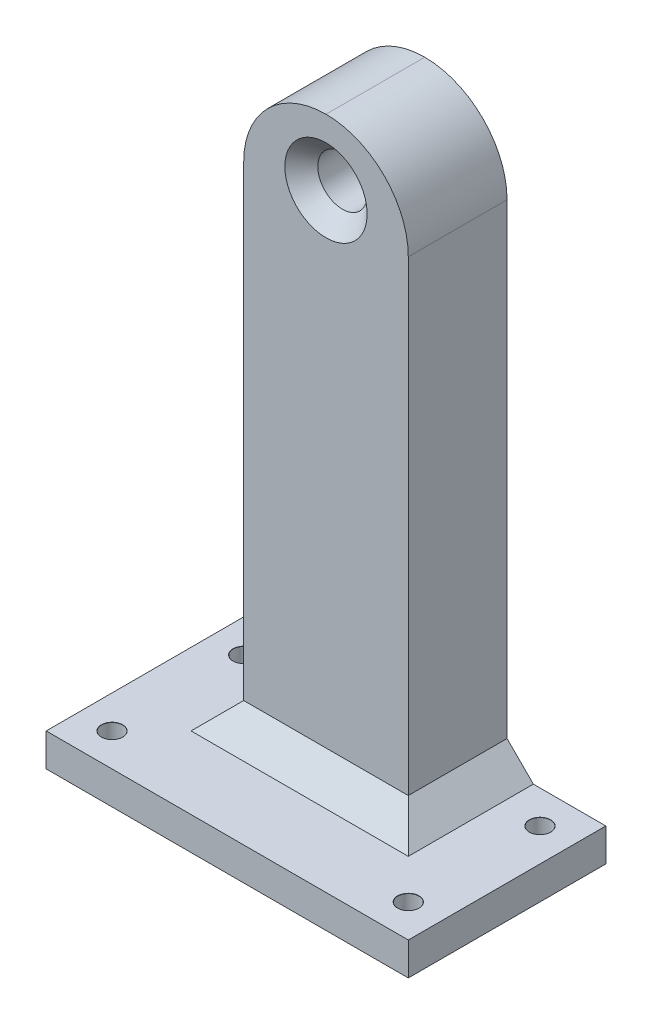
ISO-10303-21;
HEADER;
FILE_DESCRIPTION(('STEP AP214'),'2;1');
FILE_NAME('part.step','',(''),(''),'','','');
FILE_SCHEMA(('AUTOMOTIVE_DESIGN { 1 0 10303 214 1 1 1 1 }'));
ENDSEC;
DATA;
#1=APPLICATION_CONTEXT('core data for automotive mechanical design processes');
#2=APPLICATION_PROTOCOL_DEFINITION('international standard','automotive_design',2000,#1);
#3=PRODUCT_CONTEXT('',#1,'mechanical');
#4=PRODUCT('Part','Part','',(#3));
#5=PRODUCT_RELATED_PRODUCT_CATEGORY('part','',(#4));
#6=PRODUCT_DEFINITION_FORMATION('','',#4);
#7=PRODUCT_DEFINITION_CONTEXT('part definition',#1,'design');
#8=PRODUCT_DEFINITION('design','',#6,#7);
#9=PRODUCT_DEFINITION_SHAPE('','',#8);
#10=(LENGTH_UNIT() NAMED_UNIT(*) SI_UNIT(.MILLI.,.METRE.));
#11=(NAMED_UNIT(*) PLANE_ANGLE_UNIT() SI_UNIT($,.RADIAN.));
#12=(NAMED_UNIT(*) SI_UNIT($,.STERADIAN.) SOLID_ANGLE_UNIT());
#13=UNCERTAINTY_MEASURE_WITH_UNIT(LENGTH_MEASURE(1.E-05),#10,'distance_accuracy_value','');
#14=(GEOMETRIC_REPRESENTATION_CONTEXT(3) GLOBAL_UNCERTAINTY_ASSIGNED_CONTEXT((#13)) GLOBAL_UNIT_ASSIGNED_CONTEXT((#10,
#11,#12)) REPRESENTATION_CONTEXT('',''));
#15=CARTESIAN_POINT('',(0.,0.,0.));
#16=DIRECTION('',(0.,0.,1.));
#17=DIRECTION('',(1.,0.,0.));
#18=AXIS2_PLACEMENT_3D('',#15,#16,#17);
#19=CARTESIAN_POINT('',(0.,0.,15.));
#20=DIRECTION('',(0.,0.,-1.));
#21=DIRECTION('',(-1.,0.,0.));
#22=AXIS2_PLACEMENT_3D('',#19,#20,#21);
#23=PLANE('',#22);
#24=CARTESIAN_POINT('',(0.,82.37,15.));
#25=DIRECTION('',(0.,0.,-1.));
#26=DIRECTION('',(-1.,0.,0.));
#27=AXIS2_PLACEMENT_3D('',#24,#25,#26);
#28=CIRCLE('',#27,6.25000000000002);
#29=CARTESIAN_POINT('',(-6.25000000000002,82.37,15.));
#30=VERTEX_POINT('',#29);
#31=EDGE_CURVE('E11',#30,#30,#28,.T.);
#32=ORIENTED_EDGE('',*,*,#31,.T.);
#33=EDGE_LOOP('',(#32));
#34=FACE_BOUND('',#33,.T.);
#35=DIRECTION('',(0.,1.,0.));
#36=VECTOR('',#35,1.);
#37=CARTESIAN_POINT('',(12.5,92.37,15.));
#38=LINE('',#37,#36);
#39=CARTESIAN_POINT('',(12.5,9.00000000000004,15.));
#40=VERTEX_POINT('',#39);
#41=CARTESIAN_POINT('',(12.5,79.87,15.));
#42=VERTEX_POINT('',#41);
#43=EDGE_CURVE('E173',#40,#42,#38,.T.);
#44=ORIENTED_EDGE('',*,*,#43,.T.);
#45=CARTESIAN_POINT('',(0.,79.87,15.));
#46=DIRECTION('',(0.,0.,-1.));
#47=DIRECTION('',(-1.,0.,0.));
#48=AXIS2_PLACEMENT_3D('',#45,#46,#47);
#49=CIRCLE('',#48,12.5);
#50=CARTESIAN_POINT('',(0.,92.37,15.));
#51=VERTEX_POINT('',#50);
#52=EDGE_CURVE('E57',#42,#51,#49,.F.);
#53=ORIENTED_EDGE('',*,*,#52,.T.);
#54=CARTESIAN_POINT('',(0.,79.87,15.));
#55=DIRECTION('',(0.,0.,-1.));
#56=DIRECTION('',(-1.,0.,0.));
#57=AXIS2_PLACEMENT_3D('',#54,#55,#56);
#58=CIRCLE('',#57,12.5);
#59=CARTESIAN_POINT('',(-12.5,79.87,15.));
#60=VERTEX_POINT('',#59);
#61=EDGE_CURVE('E61',#51,#60,#58,.F.);
#62=ORIENTED_EDGE('',*,*,#61,.T.);
#63=DIRECTION('',(0.,-1.,0.));
#64=VECTOR('',#63,1.);
#65=CARTESIAN_POINT('',(-12.5,0.,15.));
#66=LINE('',#65,#64);
#67=CARTESIAN_POINT('',(-12.5,9.00000000000004,15.));
#68=VERTEX_POINT('',#67);
#69=EDGE_CURVE('E175',#60,#68,#66,.T.);
#70=ORIENTED_EDGE('',*,*,#69,.T.);
#71=DIRECTION('',(1.,0.,0.));
#72=VECTOR('',#71,1.);
#73=CARTESIAN_POINT('',(0.,9.00000000000003,15.));
#74=LINE('',#73,#72);
#75=EDGE_CURVE('E194',#68,#40,#74,.T.);
#76=ORIENTED_EDGE('',*,*,#75,.T.);
#77=EDGE_LOOP('',(#44,#53,#62,#70,#76));
#78=FACE_BOUND('',#77,.T.);
#79=ADVANCED_FACE('F41',(#34,#78),#23,.F.);
#80=CARTESIAN_POINT('',(0.,0.,0.));
#81=DIRECTION('',(0.,0.,-1.));
#82=DIRECTION('',(-1.,0.,0.));
#83=AXIS2_PLACEMENT_3D('',#80,#81,#82);
#84=PLANE('',#83);
#85=CARTESIAN_POINT('',(0.,79.87,0.));
#86=DIRECTION('',(0.,0.,-1.));
#87=DIRECTION('',(-1.,0.,0.));
#88=AXIS2_PLACEMENT_3D('',#85,#86,#87);
#89=CIRCLE('',#88,12.5);
#90=CARTESIAN_POINT('',(-12.5,79.87,0.));
#91=VERTEX_POINT('',#90);
#92=CARTESIAN_POINT('',(0.,92.37,0.));
#93=VERTEX_POINT('',#92);
#94=EDGE_CURVE('E201',#91,#93,#89,.T.);
#95=ORIENTED_EDGE('',*,*,#94,.T.);
#96=CARTESIAN_POINT('',(0.,79.87,0.));
#97=DIRECTION('',(0.,0.,-1.));
#98=DIRECTION('',(-1.,0.,0.));
#99=AXIS2_PLACEMENT_3D('',#96,#97,#98);
#100=CIRCLE('',#99,12.5);
#101=CARTESIAN_POINT('',(12.5,79.87,0.));
#102=VERTEX_POINT('',#101);
#103=EDGE_CURVE('E211',#93,#102,#100,.T.);
#104=ORIENTED_EDGE('',*,*,#103,.T.);
#105=DIRECTION('',(0.,1.,0.));
#106=VECTOR('',#105,1.);
#107=CARTESIAN_POINT('',(12.5,92.37,0.));
#108=LINE('',#107,#106);
#109=CARTESIAN_POINT('',(12.5,9.00000000000002,0.));
#110=VERTEX_POINT('',#109);
#111=EDGE_CURVE('E172',#110,#102,#108,.T.);
#112=ORIENTED_EDGE('',*,*,#111,.F.);
#113=DIRECTION('',(0.707106781186544,-0.707106781186551,0.));
#114=VECTOR('',#113,1.);
#115=CARTESIAN_POINT('',(12.5,9.00000000000002,0.));
#116=LINE('',#115,#114);
#117=CARTESIAN_POINT('',(16.5,5.,0.));
#118=VERTEX_POINT('',#117);
#119=EDGE_CURVE('E196',#110,#118,#116,.T.);
#120=ORIENTED_EDGE('',*,*,#119,.T.);
#121=DIRECTION('',(1.,0.,0.));
#122=VECTOR('',#121,1.);
#123=CARTESIAN_POINT('',(27.5,4.99999999999999,0.));
#124=LINE('',#123,#122);
#125=CARTESIAN_POINT('',(27.5,4.99999999999999,0.));
#126=VERTEX_POINT('',#125);
#127=EDGE_CURVE('E152',#118,#126,#124,.T.);
#128=ORIENTED_EDGE('',*,*,#127,.T.);
#129=DIRECTION('',(0.,-1.,0.));
#130=VECTOR('',#129,1.);
#131=CARTESIAN_POINT('',(27.5,0.,0.));
#132=LINE('',#131,#130);
#133=CARTESIAN_POINT('',(27.5,0.,0.));
#134=VERTEX_POINT('',#133);
#135=EDGE_CURVE('E160',#126,#134,#132,.T.);
#136=ORIENTED_EDGE('',*,*,#135,.T.);
#137=DIRECTION('',(1.,0.,0.));
#138=VECTOR('',#137,1.);
#139=CARTESIAN_POINT('',(0.,0.,0.));
#140=LINE('',#139,#138);
#141=CARTESIAN_POINT('',(-27.5,0.,0.));
#142=VERTEX_POINT('',#141);
#143=EDGE_CURVE('E128',#142,#134,#140,.T.);
#144=ORIENTED_EDGE('',*,*,#143,.F.);
#145=DIRECTION('',(0.,1.,0.));
#146=VECTOR('',#145,1.);
#147=CARTESIAN_POINT('',(-27.5,0.,0.));
#148=LINE('',#147,#146);
#149=CARTESIAN_POINT('',(-27.5,5.00000000000001,0.));
#150=VERTEX_POINT('',#149);
#151=EDGE_CURVE('E162',#142,#150,#148,.T.);
#152=ORIENTED_EDGE('',*,*,#151,.T.);
#153=CARTESIAN_POINT('',(-16.5,5.00000000000001,0.));
#154=VERTEX_POINT('',#153);
#155=EDGE_CURVE('E149',#150,#154,#124,.T.);
#156=ORIENTED_EDGE('',*,*,#155,.T.);
#157=DIRECTION('',(0.707106781186544,0.707106781186551,0.));
#158=VECTOR('',#157,1.);
#159=CARTESIAN_POINT('',(-12.5,9.00000000000004,0.));
#160=LINE('',#159,#158);
#161=CARTESIAN_POINT('',(-12.5,9.00000000000004,0.));
#162=VERTEX_POINT('',#161);
#163=EDGE_CURVE('E198',#154,#162,#160,.T.);
#164=ORIENTED_EDGE('',*,*,#163,.T.);
#165=DIRECTION('',(0.,-1.,0.));
#166=VECTOR('',#165,1.);
#167=CARTESIAN_POINT('',(-12.5,0.,0.));
#168=LINE('',#167,#166);
#169=EDGE_CURVE('E180',#91,#162,#168,.T.);
#170=ORIENTED_EDGE('',*,*,#169,.F.);
#171=EDGE_LOOP('',(#95,#104,#112,#120,#128,#136,#144,#152,#156,#164,#170));
#172=FACE_BOUND('',#171,.T.);
#173=CARTESIAN_POINT('',(0.,82.37,0.));
#174=DIRECTION('',(0.,0.,1.));
#175=DIRECTION('',(1.,0.,0.));
#176=AXIS2_PLACEMENT_3D('',#173,#174,#175);
#177=CIRCLE('',#176,3.75);
#178=CARTESIAN_POINT('',(3.75,82.37,0.));
#179=VERTEX_POINT('',#178);
#180=EDGE_CURVE('E166',#179,#179,#177,.T.);
#181=ORIENTED_EDGE('',*,*,#180,.T.);
#182=EDGE_LOOP('',(#181));
#183=FACE_BOUND('',#182,.T.);
#184=ADVANCED_FACE('F239',(#172,#183),#84,.T.);
#185=CARTESIAN_POINT('',(12.5,92.37,15.));
#186=DIRECTION('',(-1.,0.,0.));
#187=DIRECTION('',(0.,0.,1.));
#188=AXIS2_PLACEMENT_3D('',#185,#186,#187);
#189=PLANE('',#188);
#190=ORIENTED_EDGE('',*,*,#111,.T.);
#191=DIRECTION('',(0.,0.,-1.));
#192=VECTOR('',#191,1.);
#193=CARTESIAN_POINT('',(12.5,79.87,15.));
#194=LINE('',#193,#192);
#195=EDGE_CURVE('E213',#102,#42,#194,.F.);
#196=ORIENTED_EDGE('',*,*,#195,.T.);
#197=ORIENTED_EDGE('',*,*,#43,.F.);
#198=DIRECTION('',(0.,0.,-1.));
#199=VECTOR('',#198,1.);
#200=CARTESIAN_POINT('',(12.5,9.00000000000002,15.));
#201=LINE('',#200,#199);
#202=EDGE_CURVE('E177',#40,#110,#201,.T.);
#203=ORIENTED_EDGE('',*,*,#202,.T.);
#204=EDGE_LOOP('',(#190,#196,#197,#203));
#205=FACE_BOUND('',#204,.T.);
#206=ADVANCED_FACE('F245',(#205),#189,.F.);
#207=CARTESIAN_POINT('',(-12.5,0.,15.));
#208=DIRECTION('',(1.,0.,0.));
#209=DIRECTION('',(0.,0.,-1.));
#210=AXIS2_PLACEMENT_3D('',#207,#208,#209);
#211=PLANE('',#210);
#212=ORIENTED_EDGE('',*,*,#69,.F.);
#213=DIRECTION('',(0.,0.,-1.));
#214=VECTOR('',#213,1.);
#215=CARTESIAN_POINT('',(-12.5,79.87,15.));
#216=LINE('',#215,#214);
#217=EDGE_CURVE('E218',#60,#91,#216,.T.);
#218=ORIENTED_EDGE('',*,*,#217,.T.);
#219=ORIENTED_EDGE('',*,*,#169,.T.);
#220=DIRECTION('',(0.,0.,1.));
#221=VECTOR('',#220,1.);
#222=CARTESIAN_POINT('',(-12.5,9.00000000000004,15.));
#223=LINE('',#222,#221);
#224=EDGE_CURVE('E191',#162,#68,#223,.T.);
#225=ORIENTED_EDGE('',*,*,#224,.T.);
#226=EDGE_LOOP('',(#212,#218,#219,#225));
#227=FACE_BOUND('',#226,.T.);
#228=ADVANCED_FACE('F253',(#227),#211,.F.);
#229=CARTESIAN_POINT('',(0.,0.,15.));
#230=DIRECTION('',(0.,1.,0.));
#231=DIRECTION('',(-1.,0.,0.));
#232=AXIS2_PLACEMENT_3D('',#229,#230,#231);
#233=PLANE('',#232);
#234=CARTESIAN_POINT('',(-22.5,0.,5.));
#235=DIRECTION('',(0.,1.,0.));
#236=DIRECTION('',(0.,0.,1.));
#237=AXIS2_PLACEMENT_3D('',#234,#235,#236);
#238=CIRCLE('',#237,1.6);
#239=CARTESIAN_POINT('',(-22.5,0.,6.6));
#240=VERTEX_POINT('',#239);
#241=EDGE_CURVE('E361',#240,#240,#238,.T.);
#242=ORIENTED_EDGE('',*,*,#241,.T.);
#243=EDGE_LOOP('',(#242));
#244=FACE_BOUND('',#243,.T.);
#245=CARTESIAN_POINT('',(-22.5,0.,25.));
#246=DIRECTION('',(0.,1.,0.));
#247=DIRECTION('',(0.,0.,1.));
#248=AXIS2_PLACEMENT_3D('',#245,#246,#247);
#249=CIRCLE('',#248,1.6);
#250=CARTESIAN_POINT('',(-22.5,0.,26.6));
#251=VERTEX_POINT('',#250);
#252=EDGE_CURVE('E372',#251,#251,#249,.T.);
#253=ORIENTED_EDGE('',*,*,#252,.T.);
#254=EDGE_LOOP('',(#253));
#255=FACE_BOUND('',#254,.T.);
#256=CARTESIAN_POINT('',(22.5,0.,25.));
#257=DIRECTION('',(0.,1.,0.));
#258=DIRECTION('',(0.,0.,1.));
#259=AXIS2_PLACEMENT_3D('',#256,#257,#258);
#260=CIRCLE('',#259,1.6);
#261=CARTESIAN_POINT('',(22.5,0.,26.6));
#262=VERTEX_POINT('',#261);
#263=EDGE_CURVE('E381',#262,#262,#260,.T.);
#264=ORIENTED_EDGE('',*,*,#263,.T.);
#265=EDGE_LOOP('',(#264));
#266=FACE_BOUND('',#265,.T.);
#267=CARTESIAN_POINT('',(22.5,0.,5.));
#268=DIRECTION('',(0.,1.,0.));
#269=DIRECTION('',(0.,0.,1.));
#270=AXIS2_PLACEMENT_3D('',#267,#268,#269);
#271=CIRCLE('',#270,1.6);
#272=CARTESIAN_POINT('',(22.5,0.,6.6));
#273=VERTEX_POINT('',#272);
#274=EDGE_CURVE('E155',#273,#273,#271,.T.);
#275=ORIENTED_EDGE('',*,*,#274,.T.);
#276=EDGE_LOOP('',(#275));
#277=FACE_BOUND('',#276,.T.);
#278=ORIENTED_EDGE('',*,*,#143,.T.);
#279=DIRECTION('',(0.,0.,-1.));
#280=VECTOR('',#279,1.);
#281=CARTESIAN_POINT('',(27.5,0.,30.));
#282=LINE('',#281,#280);
#283=CARTESIAN_POINT('',(27.5,0.,30.));
#284=VERTEX_POINT('',#283);
#285=EDGE_CURVE('E123',#284,#134,#282,.T.);
#286=ORIENTED_EDGE('',*,*,#285,.F.);
#287=DIRECTION('',(-1.,0.,0.));
#288=VECTOR('',#287,1.);
#289=CARTESIAN_POINT('',(-27.5,0.,30.));
#290=LINE('',#289,#288);
#291=CARTESIAN_POINT('',(-27.5,0.,30.));
#292=VERTEX_POINT('',#291);
#293=EDGE_CURVE('E127',#284,#292,#290,.T.);
#294=ORIENTED_EDGE('',*,*,#293,.T.);
#295=DIRECTION('',(0.,0.,-1.));
#296=VECTOR('',#295,1.);
#297=CARTESIAN_POINT('',(-27.5,0.,30.));
#298=LINE('',#297,#296);
#299=EDGE_CURVE('E133',#292,#142,#298,.T.);
#300=ORIENTED_EDGE('',*,*,#299,.T.);
#301=EDGE_LOOP('',(#278,#286,#294,#300));
#302=FACE_BOUND('',#301,.T.);
#303=ADVANCED_FACE('F125',(#244,#255,#266,#277,#302),#233,.F.);
#304=CARTESIAN_POINT('',(0.,82.37,15.));
#305=DIRECTION('',(0.,0.,-1.));
#306=DIRECTION('',(-1.,0.,0.));
#307=AXIS2_PLACEMENT_3D('',#304,#305,#306);
#308=CYLINDRICAL_SURFACE('',#307,3.75);
#309=CARTESIAN_POINT('',(0.,82.37,12.5));
#310=DIRECTION('',(0.,0.,-1.));
#311=DIRECTION('',(-1.,0.,0.));
#312=AXIS2_PLACEMENT_3D('',#309,#310,#311);
#313=CIRCLE('',#312,3.75);
#314=CARTESIAN_POINT('',(-3.75,82.37,12.5));
#315=VERTEX_POINT('',#314);
#316=EDGE_CURVE('E50',#315,#315,#313,.F.);
#317=ORIENTED_EDGE('',*,*,#316,.T.);
#318=EDGE_LOOP('',(#317));
#319=FACE_BOUND('',#318,.T.);
#320=ORIENTED_EDGE('',*,*,#180,.F.);
#321=EDGE_LOOP('',(#320));
#322=FACE_BOUND('',#321,.T.);
#323=ADVANCED_FACE('F224',(#319,#322),#308,.F.);
#324=CARTESIAN_POINT('',(27.5,4.99999999999999,30.));
#325=DIRECTION('',(0.,1.,0.));
#326=DIRECTION('',(-1.,0.,0.));
#327=AXIS2_PLACEMENT_3D('',#324,#325,#326);
#328=PLANE('',#327);
#329=ORIENTED_EDGE('',*,*,#127,.F.);
#330=DIRECTION('',(0.,0.,1.));
#331=VECTOR('',#330,1.);
#332=CARTESIAN_POINT('',(16.5,5.,30.));
#333=LINE('',#332,#331);
#334=CARTESIAN_POINT('',(16.5,5.,19.));
#335=VERTEX_POINT('',#334);
#336=EDGE_CURVE('E189',#118,#335,#333,.T.);
#337=ORIENTED_EDGE('',*,*,#336,.T.);
#338=DIRECTION('',(-1.,0.,0.));
#339=VECTOR('',#338,1.);
#340=CARTESIAN_POINT('',(27.5,4.99999999999999,19.));
#341=LINE('',#340,#339);
#342=CARTESIAN_POINT('',(-16.5,5.00000000000001,19.));
#343=VERTEX_POINT('',#342);
#344=EDGE_CURVE('E185',#335,#343,#341,.T.);
#345=ORIENTED_EDGE('',*,*,#344,.T.);
#346=DIRECTION('',(0.,0.,-1.));
#347=VECTOR('',#346,1.);
#348=CARTESIAN_POINT('',(-16.5,5.00000000000001,30.));
#349=LINE('',#348,#347);
#350=EDGE_CURVE('E187',#343,#154,#349,.T.);
#351=ORIENTED_EDGE('',*,*,#350,.T.);
#352=ORIENTED_EDGE('',*,*,#155,.F.);
#353=DIRECTION('',(0.,0.,-1.));
#354=VECTOR('',#353,1.);
#355=CARTESIAN_POINT('',(-27.5,5.00000000000001,30.));
#356=LINE('',#355,#354);
#357=CARTESIAN_POINT('',(-27.5,5.00000000000001,30.));
#358=VERTEX_POINT('',#357);
#359=EDGE_CURVE('E167',#358,#150,#356,.T.);
#360=ORIENTED_EDGE('',*,*,#359,.F.);
#361=DIRECTION('',(1.,0.,0.));
#362=VECTOR('',#361,1.);
#363=CARTESIAN_POINT('',(27.5,4.99999999999999,30.));
#364=LINE('',#363,#362);
#365=CARTESIAN_POINT('',(27.5,4.99999999999999,30.));
#366=VERTEX_POINT('',#365);
#367=EDGE_CURVE('E134',#358,#366,#364,.T.);
#368=ORIENTED_EDGE('',*,*,#367,.T.);
#369=DIRECTION('',(0.,0.,-1.));
#370=VECTOR('',#369,1.);
#371=CARTESIAN_POINT('',(27.5,4.99999999999999,30.));
#372=LINE('',#371,#370);
#373=EDGE_CURVE('E148',#366,#126,#372,.T.);
#374=ORIENTED_EDGE('',*,*,#373,.T.);
#375=EDGE_LOOP('',(#329,#337,#345,#351,#352,#360,#368,#374));
#376=FACE_BOUND('',#375,.T.);
#377=CARTESIAN_POINT('',(-22.5,5.00000000000001,5.));
#378=DIRECTION('',(0.,1.,0.));
#379=DIRECTION('',(0.,0.,1.));
#380=AXIS2_PLACEMENT_3D('',#377,#378,#379);
#381=CIRCLE('',#380,1.625);
#382=CARTESIAN_POINT('',(-22.5,5.00000000000001,6.625));
#383=VERTEX_POINT('',#382);
#384=EDGE_CURVE('E209',#383,#383,#381,.T.);
#385=ORIENTED_EDGE('',*,*,#384,.F.);
#386=EDGE_LOOP('',(#385));
#387=FACE_BOUND('',#386,.T.);
#388=CARTESIAN_POINT('',(-22.5,5.00000000000001,25.));
#389=DIRECTION('',(0.,1.,0.));
#390=DIRECTION('',(0.,0.,1.));
#391=AXIS2_PLACEMENT_3D('',#388,#389,#390);
#392=CIRCLE('',#391,1.625);
#393=CARTESIAN_POINT('',(-22.5,5.00000000000001,26.625));
#394=VERTEX_POINT('',#393);
#395=EDGE_CURVE('E366',#394,#394,#392,.T.);
#396=ORIENTED_EDGE('',*,*,#395,.F.);
#397=EDGE_LOOP('',(#396));
#398=FACE_BOUND('',#397,.T.);
#399=CARTESIAN_POINT('',(22.5,5.,25.));
#400=DIRECTION('',(0.,1.,0.));
#401=DIRECTION('',(0.,0.,1.));
#402=AXIS2_PLACEMENT_3D('',#399,#400,#401);
#403=CIRCLE('',#402,1.625);
#404=CARTESIAN_POINT('',(22.5,5.,26.625));
#405=VERTEX_POINT('',#404);
#406=EDGE_CURVE('E375',#405,#405,#403,.T.);
#407=ORIENTED_EDGE('',*,*,#406,.F.);
#408=EDGE_LOOP('',(#407));
#409=FACE_BOUND('',#408,.T.);
#410=CARTESIAN_POINT('',(22.5,5.,5.));
#411=DIRECTION('',(0.,1.,0.));
#412=DIRECTION('',(0.,0.,1.));
#413=AXIS2_PLACEMENT_3D('',#410,#411,#412);
#414=CIRCLE('',#413,1.625);
#415=CARTESIAN_POINT('',(22.5,5.,6.625));
#416=VERTEX_POINT('',#415);
#417=EDGE_CURVE('E384',#416,#416,#414,.T.);
#418=ORIENTED_EDGE('',*,*,#417,.F.);
#419=EDGE_LOOP('',(#418));
#420=FACE_BOUND('',#419,.T.);
#421=ADVANCED_FACE('F307',(#376,#387,#398,#409,#420),#328,.T.);
#422=CARTESIAN_POINT('',(27.5,0.,30.));
#423=DIRECTION('',(1.,0.,0.));
#424=DIRECTION('',(0.,0.,-1.));
#425=AXIS2_PLACEMENT_3D('',#422,#423,#424);
#426=PLANE('',#425);
#427=ORIENTED_EDGE('',*,*,#135,.F.);
#428=ORIENTED_EDGE('',*,*,#373,.F.);
#429=DIRECTION('',(0.,-1.,0.));
#430=VECTOR('',#429,1.);
#431=CARTESIAN_POINT('',(27.5,0.,30.));
#432=LINE('',#431,#430);
#433=EDGE_CURVE('E141',#366,#284,#432,.T.);
#434=ORIENTED_EDGE('',*,*,#433,.T.);
#435=ORIENTED_EDGE('',*,*,#285,.T.);
#436=EDGE_LOOP('',(#427,#428,#434,#435));
#437=FACE_BOUND('',#436,.T.);
#438=ADVANCED_FACE('F146',(#437),#426,.T.);
#439=CARTESIAN_POINT('',(-27.5,0.,30.));
#440=DIRECTION('',(-1.,0.,0.));
#441=DIRECTION('',(0.,0.,1.));
#442=AXIS2_PLACEMENT_3D('',#439,#440,#441);
#443=PLANE('',#442);
#444=ORIENTED_EDGE('',*,*,#151,.F.);
#445=ORIENTED_EDGE('',*,*,#299,.F.);
#446=DIRECTION('',(0.,1.,0.));
#447=VECTOR('',#446,1.);
#448=CARTESIAN_POINT('',(-27.5,0.,30.));
#449=LINE('',#448,#447);
#450=EDGE_CURVE('E144',#292,#358,#449,.T.);
#451=ORIENTED_EDGE('',*,*,#450,.T.);
#452=ORIENTED_EDGE('',*,*,#359,.T.);
#453=EDGE_LOOP('',(#444,#445,#451,#452));
#454=FACE_BOUND('',#453,.T.);
#455=ADVANCED_FACE('F311',(#454),#443,.T.);
#456=CARTESIAN_POINT('',(0.,0.,30.));
#457=DIRECTION('',(0.,0.,1.));
#458=DIRECTION('',(1.,0.,0.));
#459=AXIS2_PLACEMENT_3D('',#456,#457,#458);
#460=PLANE('',#459);
#461=ORIENTED_EDGE('',*,*,#433,.F.);
#462=ORIENTED_EDGE('',*,*,#367,.F.);
#463=ORIENTED_EDGE('',*,*,#450,.F.);
#464=ORIENTED_EDGE('',*,*,#293,.F.);
#465=EDGE_LOOP('',(#461,#462,#463,#464));
#466=FACE_BOUND('',#465,.T.);
#467=ADVANCED_FACE('F139',(#466),#460,.T.);
#468=CARTESIAN_POINT('',(22.5,5.,5.));
#469=DIRECTION('',(0.,1.,0.));
#470=DIRECTION('',(0.,0.,1.));
#471=AXIS2_PLACEMENT_3D('',#468,#469,#470);
#472=CYLINDRICAL_SURFACE('',#471,1.6);
#473=ORIENTED_EDGE('',*,*,#274,.F.);
#474=EDGE_LOOP('',(#473));
#475=FACE_BOUND('',#474,.T.);
#476=CARTESIAN_POINT('',(22.5,4.975,5.));
#477=DIRECTION('',(0.,1.,0.));
#478=DIRECTION('',(0.,0.,1.));
#479=AXIS2_PLACEMENT_3D('',#476,#477,#478);
#480=CIRCLE('',#479,1.6);
#481=CARTESIAN_POINT('',(22.5,4.975,6.6));
#482=VERTEX_POINT('',#481);
#483=EDGE_CURVE('E386',#482,#482,#480,.T.);
#484=ORIENTED_EDGE('',*,*,#483,.T.);
#485=EDGE_LOOP('',(#484));
#486=FACE_BOUND('',#485,.T.);
#487=ADVANCED_FACE('F318',(#475,#486),#472,.F.);
#488=CARTESIAN_POINT('',(22.5,5.,5.));
#489=DIRECTION('',(0.,1.,0.));
#490=DIRECTION('',(0.,0.,1.));
#491=AXIS2_PLACEMENT_3D('',#488,#489,#490);
#492=CONICAL_SURFACE('',#491,1.625,0.785398163397344);
#493=ORIENTED_EDGE('',*,*,#483,.F.);
#494=EDGE_LOOP('',(#493));
#495=FACE_BOUND('',#494,.T.);
#496=ORIENTED_EDGE('',*,*,#417,.T.);
#497=EDGE_LOOP('',(#496));
#498=FACE_BOUND('',#497,.T.);
#499=ADVANCED_FACE('F325',(#495,#498),#492,.F.);
#500=CARTESIAN_POINT('',(22.5,5.,25.));
#501=DIRECTION('',(0.,1.,0.));
#502=DIRECTION('',(0.,0.,1.));
#503=AXIS2_PLACEMENT_3D('',#500,#501,#502);
#504=CYLINDRICAL_SURFACE('',#503,1.6);
#505=ORIENTED_EDGE('',*,*,#263,.F.);
#506=EDGE_LOOP('',(#505));
#507=FACE_BOUND('',#506,.T.);
#508=CARTESIAN_POINT('',(22.5,4.975,25.));
#509=DIRECTION('',(0.,1.,0.));
#510=DIRECTION('',(0.,0.,1.));
#511=AXIS2_PLACEMENT_3D('',#508,#509,#510);
#512=CIRCLE('',#511,1.6);
#513=CARTESIAN_POINT('',(22.5,4.975,26.6));
#514=VERTEX_POINT('',#513);
#515=EDGE_CURVE('E378',#514,#514,#512,.T.);
#516=ORIENTED_EDGE('',*,*,#515,.T.);
#517=EDGE_LOOP('',(#516));
#518=FACE_BOUND('',#517,.T.);
#519=ADVANCED_FACE('F329',(#507,#518),#504,.F.);
#520=CARTESIAN_POINT('',(22.5,5.,25.));
#521=DIRECTION('',(0.,1.,0.));
#522=DIRECTION('',(0.,0.,1.));
#523=AXIS2_PLACEMENT_3D('',#520,#521,#522);
#524=CONICAL_SURFACE('',#523,1.625,0.785398163397344);
#525=ORIENTED_EDGE('',*,*,#515,.F.);
#526=EDGE_LOOP('',(#525));
#527=FACE_BOUND('',#526,.T.);
#528=ORIENTED_EDGE('',*,*,#406,.T.);
#529=EDGE_LOOP('',(#528));
#530=FACE_BOUND('',#529,.T.);
#531=ADVANCED_FACE('F333',(#527,#530),#524,.F.);
#532=CARTESIAN_POINT('',(-22.5,5.00000000000001,25.));
#533=DIRECTION('',(0.,1.,0.));
#534=DIRECTION('',(0.,0.,1.));
#535=AXIS2_PLACEMENT_3D('',#532,#533,#534);
#536=CYLINDRICAL_SURFACE('',#535,1.6);
#537=ORIENTED_EDGE('',*,*,#252,.F.);
#538=EDGE_LOOP('',(#537));
#539=FACE_BOUND('',#538,.T.);
#540=CARTESIAN_POINT('',(-22.5,4.97500000000001,25.));
#541=DIRECTION('',(0.,1.,0.));
#542=DIRECTION('',(0.,0.,1.));
#543=AXIS2_PLACEMENT_3D('',#540,#541,#542);
#544=CIRCLE('',#543,1.6);
#545=CARTESIAN_POINT('',(-22.5,4.97500000000001,26.6));
#546=VERTEX_POINT('',#545);
#547=EDGE_CURVE('E369',#546,#546,#544,.T.);
#548=ORIENTED_EDGE('',*,*,#547,.T.);
#549=EDGE_LOOP('',(#548));
#550=FACE_BOUND('',#549,.T.);
#551=ADVANCED_FACE('F337',(#539,#550),#536,.F.);
#552=CARTESIAN_POINT('',(-22.5,5.00000000000001,25.));
#553=DIRECTION('',(0.,1.,0.));
#554=DIRECTION('',(0.,0.,1.));
#555=AXIS2_PLACEMENT_3D('',#552,#553,#554);
#556=CONICAL_SURFACE('',#555,1.625,0.785398163397344);
#557=ORIENTED_EDGE('',*,*,#547,.F.);
#558=EDGE_LOOP('',(#557));
#559=FACE_BOUND('',#558,.T.);
#560=ORIENTED_EDGE('',*,*,#395,.T.);
#561=EDGE_LOOP('',(#560));
#562=FACE_BOUND('',#561,.T.);
#563=ADVANCED_FACE('F341',(#559,#562),#556,.F.);
#564=CARTESIAN_POINT('',(-22.5,5.00000000000001,5.));
#565=DIRECTION('',(0.,1.,0.));
#566=DIRECTION('',(0.,0.,1.));
#567=AXIS2_PLACEMENT_3D('',#564,#565,#566);
#568=CYLINDRICAL_SURFACE('',#567,1.6);
#569=ORIENTED_EDGE('',*,*,#241,.F.);
#570=EDGE_LOOP('',(#569));
#571=FACE_BOUND('',#570,.T.);
#572=CARTESIAN_POINT('',(-22.5,4.97500000000001,5.));
#573=DIRECTION('',(0.,1.,0.));
#574=DIRECTION('',(0.,0.,1.));
#575=AXIS2_PLACEMENT_3D('',#572,#573,#574);
#576=CIRCLE('',#575,1.6);
#577=CARTESIAN_POINT('',(-22.5,4.97500000000001,6.6));
#578=VERTEX_POINT('',#577);
#579=EDGE_CURVE('E357',#578,#578,#576,.T.);
#580=ORIENTED_EDGE('',*,*,#579,.T.);
#581=EDGE_LOOP('',(#580));
#582=FACE_BOUND('',#581,.T.);
#583=ADVANCED_FACE('F345',(#571,#582),#568,.F.);
#584=CARTESIAN_POINT('',(-22.5,5.00000000000001,5.));
#585=DIRECTION('',(0.,1.,0.));
#586=DIRECTION('',(0.,0.,1.));
#587=AXIS2_PLACEMENT_3D('',#584,#585,#586);
#588=CONICAL_SURFACE('',#587,1.625,0.785398163397344);
#589=ORIENTED_EDGE('',*,*,#579,.F.);
#590=EDGE_LOOP('',(#589));
#591=FACE_BOUND('',#590,.T.);
#592=ORIENTED_EDGE('',*,*,#384,.T.);
#593=EDGE_LOOP('',(#592));
#594=FACE_BOUND('',#593,.T.);
#595=ADVANCED_FACE('F280',(#591,#594),#588,.F.);
#596=CARTESIAN_POINT('',(-12.5,9.00000000000004,15.));
#597=DIRECTION('',(0.707106781186551,-0.707106781186544,0.));
#598=DIRECTION('',(0.,0.,1.));
#599=AXIS2_PLACEMENT_3D('',#596,#597,#598);
#600=PLANE('',#599);
#601=ORIENTED_EDGE('',*,*,#163,.F.);
#602=ORIENTED_EDGE('',*,*,#350,.F.);
#603=DIRECTION('',(-0.577350269189624,-0.57735026918963,0.577350269189624));
#604=VECTOR('',#603,1.);
#605=CARTESIAN_POINT('',(-8.33333333333337,13.1666666666667,10.8333333333334));
#606=LINE('',#605,#604);
#607=EDGE_CURVE('E205',#68,#343,#606,.T.);
#608=ORIENTED_EDGE('',*,*,#607,.F.);
#609=ORIENTED_EDGE('',*,*,#224,.F.);
#610=EDGE_LOOP('',(#601,#602,#608,#609));
#611=FACE_BOUND('',#610,.T.);
#612=ADVANCED_FACE('F275',(#611),#600,.F.);
#613=CARTESIAN_POINT('',(0.,9.00000000000003,15.));
#614=DIRECTION('',(0.,-0.707106781186544,-0.707106781186551));
#615=DIRECTION('',(1.,0.,0.));
#616=AXIS2_PLACEMENT_3D('',#613,#614,#615);
#617=PLANE('',#616);
#618=ORIENTED_EDGE('',*,*,#607,.T.);
#619=ORIENTED_EDGE('',*,*,#344,.F.);
#620=DIRECTION('',(-0.577350269189625,0.57735026918963,-0.577350269189623));
#621=VECTOR('',#620,1.);
#622=CARTESIAN_POINT('',(8.33333333333335,13.1666666666667,10.8333333333334));
#623=LINE('',#622,#621);
#624=EDGE_CURVE('E202',#40,#335,#623,.F.);
#625=ORIENTED_EDGE('',*,*,#624,.F.);
#626=ORIENTED_EDGE('',*,*,#75,.F.);
#627=EDGE_LOOP('',(#618,#619,#625,#626));
#628=FACE_BOUND('',#627,.T.);
#629=ADVANCED_FACE('F268',(#628),#617,.F.);
#630=CARTESIAN_POINT('',(12.5,9.00000000000002,15.));
#631=DIRECTION('',(-0.70710678118655,-0.707106781186544,0.));
#632=DIRECTION('',(0.,0.,-1.));
#633=AXIS2_PLACEMENT_3D('',#630,#631,#632);
#634=PLANE('',#633);
#635=ORIENTED_EDGE('',*,*,#624,.T.);
#636=ORIENTED_EDGE('',*,*,#336,.F.);
#637=ORIENTED_EDGE('',*,*,#119,.F.);
#638=ORIENTED_EDGE('',*,*,#202,.F.);
#639=EDGE_LOOP('',(#635,#636,#637,#638));
#640=FACE_BOUND('',#639,.T.);
#641=ADVANCED_FACE('F262',(#640),#634,.F.);
#642=CARTESIAN_POINT('',(0.,79.87,15.));
#643=DIRECTION('',(0.,0.,-1.));
#644=DIRECTION('',(-1.,0.,0.));
#645=AXIS2_PLACEMENT_3D('',#642,#643,#644);
#646=CYLINDRICAL_SURFACE('',#645,12.5);
#647=ORIENTED_EDGE('',*,*,#217,.F.);
#648=ORIENTED_EDGE('',*,*,#61,.F.);
#649=DIRECTION('',(0.,0.,-1.));
#650=VECTOR('',#649,1.);
#651=CARTESIAN_POINT('',(0.,92.37,15.));
#652=LINE('',#651,#650);
#653=EDGE_CURVE('E206',#93,#51,#652,.F.);
#654=ORIENTED_EDGE('',*,*,#653,.F.);
#655=ORIENTED_EDGE('',*,*,#94,.F.);
#656=EDGE_LOOP('',(#647,#648,#654,#655));
#657=FACE_BOUND('',#656,.T.);
#658=ADVANCED_FACE('F234',(#657),#646,.T.);
#659=CARTESIAN_POINT('',(0.,79.87,15.));
#660=DIRECTION('',(0.,0.,-1.));
#661=DIRECTION('',(-1.,0.,0.));
#662=AXIS2_PLACEMENT_3D('',#659,#660,#661);
#663=CYLINDRICAL_SURFACE('',#662,12.5);
#664=ORIENTED_EDGE('',*,*,#52,.F.);
#665=ORIENTED_EDGE('',*,*,#195,.F.);
#666=ORIENTED_EDGE('',*,*,#103,.F.);
#667=ORIENTED_EDGE('',*,*,#653,.T.);
#668=EDGE_LOOP('',(#664,#665,#666,#667));
#669=FACE_BOUND('',#668,.T.);
#670=ADVANCED_FACE('F228',(#669),#663,.T.);
#671=CARTESIAN_POINT('',(0.,82.37,12.5));
#672=DIRECTION('',(0.,0.,1.));
#673=DIRECTION('',(1.,0.,0.));
#674=AXIS2_PLACEMENT_3D('',#671,#672,#673);
#675=CONICAL_SURFACE('',#674,3.75,0.785398163397448);
#676=ORIENTED_EDGE('',*,*,#31,.F.);
#677=EDGE_LOOP('',(#676));
#678=FACE_BOUND('',#677,.T.);
#679=ORIENTED_EDGE('',*,*,#316,.F.);
#680=EDGE_LOOP('',(#679));
#681=FACE_BOUND('',#680,.T.);
#682=ADVANCED_FACE('F44',(#678,#681),#675,.F.);
#683=CLOSED_SHELL('',(#79,#184,#206,#228,#303,#323,#421,#438,#455,#467,#487,#499,#519,#531,#551,
#563,#583,#595,#612,#629,#641,#658,#670,#682));
#684=MANIFOLD_SOLID_BREP('B2',#683);
#685=ADVANCED_BREP_SHAPE_REPRESENTATION('',(#18,#684),#14);
#686=SHAPE_DEFINITION_REPRESENTATION(#9,#685);
ENDSEC;
END-ISO-10303-21;
